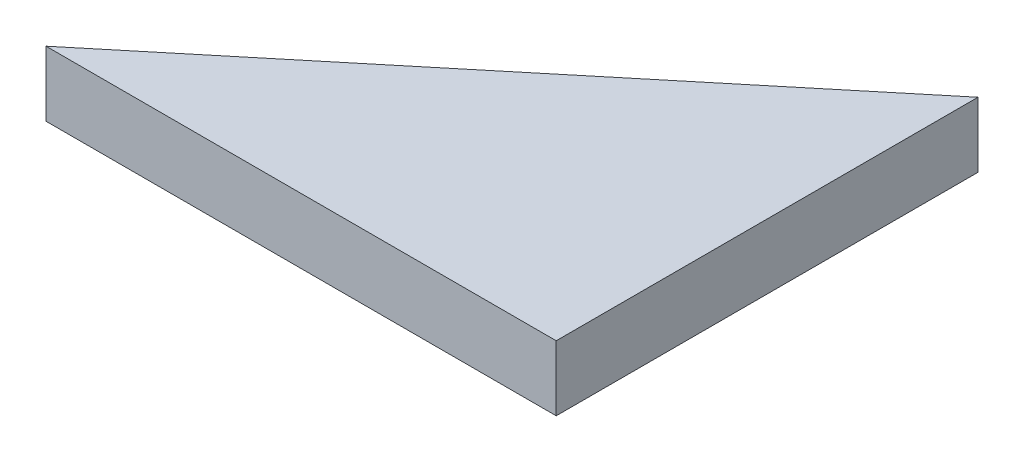
ISO-10303-21;
HEADER;
FILE_DESCRIPTION(('STEP AP214'),'2;1');
FILE_NAME('part.step','',(''),(''),'','','');
FILE_SCHEMA(('AUTOMOTIVE_DESIGN { 1 0 10303 214 1 1 1 1 }'));
ENDSEC;
DATA;
#1=APPLICATION_CONTEXT('core data for automotive mechanical design processes');
#2=APPLICATION_PROTOCOL_DEFINITION('international standard','automotive_design',2000,#1);
#3=PRODUCT_CONTEXT('',#1,'mechanical');
#4=PRODUCT('Part','Part','',(#3));
#5=PRODUCT_RELATED_PRODUCT_CATEGORY('part','',(#4));
#6=PRODUCT_DEFINITION_FORMATION('','',#4);
#7=PRODUCT_DEFINITION_CONTEXT('part definition',#1,'design');
#8=PRODUCT_DEFINITION('design','',#6,#7);
#9=PRODUCT_DEFINITION_SHAPE('','',#8);
#10=(LENGTH_UNIT() NAMED_UNIT(*) SI_UNIT(.MILLI.,.METRE.));
#11=(NAMED_UNIT(*) PLANE_ANGLE_UNIT() SI_UNIT($,.RADIAN.));
#12=(NAMED_UNIT(*) SI_UNIT($,.STERADIAN.) SOLID_ANGLE_UNIT());
#13=UNCERTAINTY_MEASURE_WITH_UNIT(LENGTH_MEASURE(1.E-05),#10,'distance_accuracy_value','');
#14=(GEOMETRIC_REPRESENTATION_CONTEXT(3) GLOBAL_UNCERTAINTY_ASSIGNED_CONTEXT((#13)) GLOBAL_UNIT_ASSIGNED_CONTEXT((#10,
#11,#12)) REPRESENTATION_CONTEXT('',''));
#15=CARTESIAN_POINT('',(0.,0.,0.));
#16=DIRECTION('',(0.,0.,1.));
#17=DIRECTION('',(1.,0.,0.));
#18=AXIS2_PLACEMENT_3D('',#15,#16,#17);
#19=CARTESIAN_POINT('',(4.94899973273277,40.2509979903698,27.4501722306013));
#20=DIRECTION('',(-0.637153148102277,0.,-0.770737222315984));
#21=DIRECTION('',(-0.770737222315984,0.,0.637153148102277));
#22=AXIS2_PLACEMENT_3D('',#19,#20,#21);
#23=PLANE('',#22);
#24=DIRECTION('',(0.770737222315984,0.,-0.637153148102277));
#25=VECTOR('',#24,1.);
#26=CARTESIAN_POINT('',(4.94899973273277,38.2690019905567,27.4501722306013));
#27=LINE('',#26,#25);
#28=CARTESIAN_POINT('',(4.94899973273277,38.2690019905567,27.4501722306013));
#29=VERTEX_POINT('',#28);
#30=CARTESIAN_POINT('',(20.5022487404184,38.2690019905567,14.5926102995872));
#31=VERTEX_POINT('',#30);
#32=EDGE_CURVE('E103',#29,#31,#27,.T.);
#33=ORIENTED_EDGE('',*,*,#32,.F.);
#34=DIRECTION('',(0.,-1.,0.));
#35=VECTOR('',#34,1.);
#36=CARTESIAN_POINT('',(4.94899973273277,40.2509979903698,27.4501722306013));
#37=LINE('',#36,#35);
#38=CARTESIAN_POINT('',(4.94899973273277,40.2509979903698,27.4501722306013));
#39=VERTEX_POINT('',#38);
#40=EDGE_CURVE('E11',#39,#29,#37,.T.);
#41=ORIENTED_EDGE('',*,*,#40,.F.);
#42=DIRECTION('',(0.770737222315984,0.,-0.637153148102277));
#43=VECTOR('',#42,1.);
#44=CARTESIAN_POINT('',(4.94899973273277,40.2509979903698,27.4501722306013));
#45=LINE('',#44,#43);
#46=CARTESIAN_POINT('',(20.5022487404184,40.2509979903698,14.5926102995872));
#47=VERTEX_POINT('',#46);
#48=EDGE_CURVE('E91',#39,#47,#45,.T.);
#49=ORIENTED_EDGE('',*,*,#48,.T.);
#50=DIRECTION('',(0.,-1.,0.));
#51=VECTOR('',#50,1.);
#52=CARTESIAN_POINT('',(20.5022487404184,40.2509979903698,14.5926102995872));
#53=LINE('',#52,#51);
#54=EDGE_CURVE('E48',#47,#31,#53,.T.);
#55=ORIENTED_EDGE('',*,*,#54,.T.);
#56=EDGE_LOOP('',(#33,#41,#49,#55));
#57=FACE_BOUND('',#56,.T.);
#58=ADVANCED_FACE('F45',(#57),#23,.T.);
#59=CARTESIAN_POINT('',(20.5022487404184,40.2509979903698,27.4501722306013));
#60=DIRECTION('',(0.,0.,1.));
#61=DIRECTION('',(1.,0.,0.));
#62=AXIS2_PLACEMENT_3D('',#59,#60,#61);
#63=PLANE('',#62);
#64=DIRECTION('',(-1.,0.,0.));
#65=VECTOR('',#64,1.);
#66=CARTESIAN_POINT('',(20.5022487404184,38.2690019905567,27.4501722306013));
#67=LINE('',#66,#65);
#68=CARTESIAN_POINT('',(20.5022487404184,38.2690019905567,27.4501722306013));
#69=VERTEX_POINT('',#68);
#70=EDGE_CURVE('E95',#69,#29,#67,.T.);
#71=ORIENTED_EDGE('',*,*,#70,.F.);
#72=DIRECTION('',(0.,-1.,0.));
#73=VECTOR('',#72,1.);
#74=CARTESIAN_POINT('',(20.5022487404184,40.2509979903698,27.4501722306013));
#75=LINE('',#74,#73);
#76=CARTESIAN_POINT('',(20.5022487404184,40.2509979903698,27.4501722306013));
#77=VERTEX_POINT('',#76);
#78=EDGE_CURVE('E55',#77,#69,#75,.T.);
#79=ORIENTED_EDGE('',*,*,#78,.F.);
#80=DIRECTION('',(-1.,0.,0.));
#81=VECTOR('',#80,1.);
#82=CARTESIAN_POINT('',(20.5022487404184,40.2509979903698,27.4501722306013));
#83=LINE('',#82,#81);
#84=EDGE_CURVE('E88',#77,#39,#83,.T.);
#85=ORIENTED_EDGE('',*,*,#84,.T.);
#86=ORIENTED_EDGE('',*,*,#40,.T.);
#87=EDGE_LOOP('',(#71,#79,#85,#86));
#88=FACE_BOUND('',#87,.T.);
#89=ADVANCED_FACE('F110',(#88),#63,.T.);
#90=CARTESIAN_POINT('',(20.5022487404184,40.2509979903698,14.5926102995872));
#91=DIRECTION('',(1.,0.,0.));
#92=DIRECTION('',(0.,0.,-1.));
#93=AXIS2_PLACEMENT_3D('',#90,#91,#92);
#94=PLANE('',#93);
#95=DIRECTION('',(0.,0.,1.));
#96=VECTOR('',#95,1.);
#97=CARTESIAN_POINT('',(20.5022487404184,38.2690019905567,14.5926102995872));
#98=LINE('',#97,#96);
#99=EDGE_CURVE('E85',#31,#69,#98,.T.);
#100=ORIENTED_EDGE('',*,*,#99,.F.);
#101=ORIENTED_EDGE('',*,*,#54,.F.);
#102=DIRECTION('',(0.,0.,1.));
#103=VECTOR('',#102,1.);
#104=CARTESIAN_POINT('',(20.5022487404184,40.2509979903698,14.5926102995872));
#105=LINE('',#104,#103);
#106=EDGE_CURVE('E83',#47,#77,#105,.T.);
#107=ORIENTED_EDGE('',*,*,#106,.T.);
#108=ORIENTED_EDGE('',*,*,#78,.T.);
#109=EDGE_LOOP('',(#100,#101,#107,#108));
#110=FACE_BOUND('',#109,.T.);
#111=ADVANCED_FACE('F82',(#110),#94,.T.);
#112=CARTESIAN_POINT('',(0.,40.2509979903698,0.));
#113=DIRECTION('',(0.,-1.,0.));
#114=DIRECTION('',(0.,0.,-1.));
#115=AXIS2_PLACEMENT_3D('',#112,#113,#114);
#116=PLANE('',#115);
#117=ORIENTED_EDGE('',*,*,#48,.F.);
#118=ORIENTED_EDGE('',*,*,#84,.F.);
#119=ORIENTED_EDGE('',*,*,#106,.F.);
#120=EDGE_LOOP('',(#117,#118,#119));
#121=FACE_BOUND('',#120,.T.);
#122=ADVANCED_FACE('F90',(#121),#116,.F.);
#123=CARTESIAN_POINT('',(0.,38.2690019905567,0.));
#124=DIRECTION('',(0.,-1.,0.));
#125=DIRECTION('',(0.,0.,-1.));
#126=AXIS2_PLACEMENT_3D('',#123,#124,#125);
#127=PLANE('',#126);
#128=ORIENTED_EDGE('',*,*,#32,.T.);
#129=ORIENTED_EDGE('',*,*,#99,.T.);
#130=ORIENTED_EDGE('',*,*,#70,.T.);
#131=EDGE_LOOP('',(#128,#129,#130));
#132=FACE_BOUND('',#131,.T.);
#133=ADVANCED_FACE('F109',(#132),#127,.T.);
#134=CLOSED_SHELL('',(#58,#89,#111,#122,#133));
#135=MANIFOLD_SOLID_BREP('B2',#134);
#136=ADVANCED_BREP_SHAPE_REPRESENTATION('',(#18,#135),#14);
#137=SHAPE_DEFINITION_REPRESENTATION(#9,#136);
ENDSEC;
END-ISO-10303-21;
